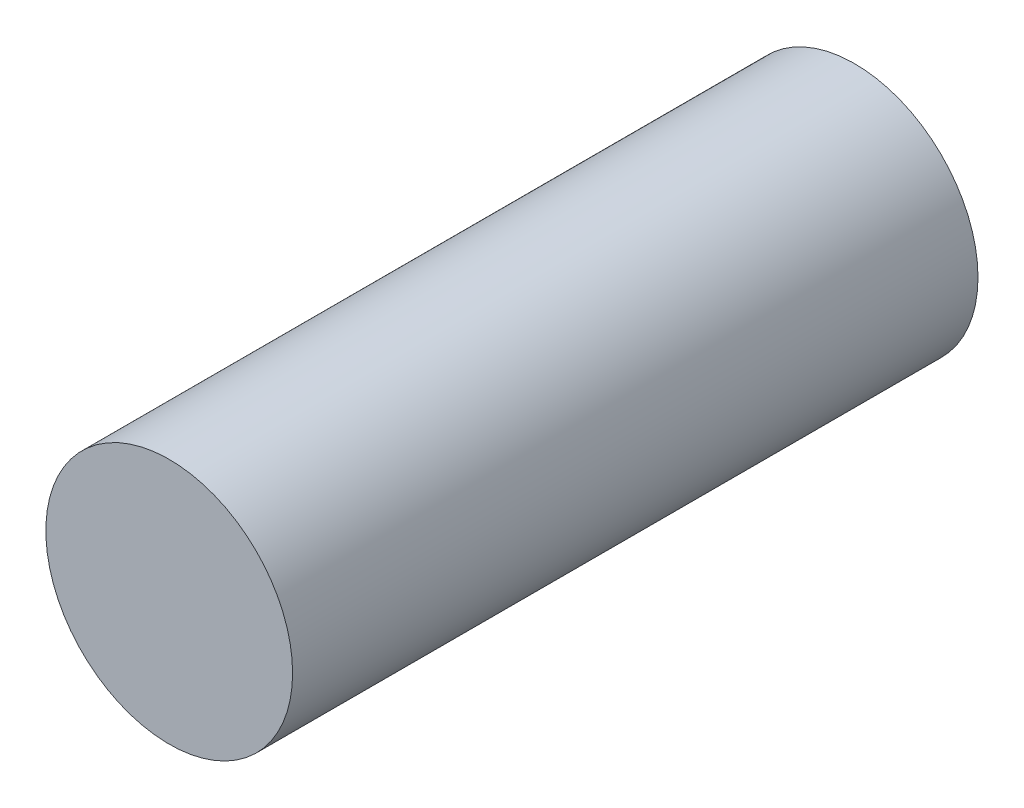
ISO-10303-21;
HEADER;
FILE_DESCRIPTION(('STEP AP214'),'2;1');
FILE_NAME('part.step','',(''),(''),'','','');
FILE_SCHEMA(('AUTOMOTIVE_DESIGN { 1 0 10303 214 1 1 1 1 }'));
ENDSEC;
DATA;
#1=APPLICATION_CONTEXT('core data for automotive mechanical design processes');
#2=APPLICATION_PROTOCOL_DEFINITION('international standard','automotive_design',2000,#1);
#3=PRODUCT_CONTEXT('',#1,'mechanical');
#4=PRODUCT('Part','Part','',(#3));
#5=PRODUCT_RELATED_PRODUCT_CATEGORY('part','',(#4));
#6=PRODUCT_DEFINITION_FORMATION('','',#4);
#7=PRODUCT_DEFINITION_CONTEXT('part definition',#1,'design');
#8=PRODUCT_DEFINITION('design','',#6,#7);
#9=PRODUCT_DEFINITION_SHAPE('','',#8);
#10=(LENGTH_UNIT() NAMED_UNIT(*) SI_UNIT(.MILLI.,.METRE.));
#11=(NAMED_UNIT(*) PLANE_ANGLE_UNIT() SI_UNIT($,.RADIAN.));
#12=(NAMED_UNIT(*) SI_UNIT($,.STERADIAN.) SOLID_ANGLE_UNIT());
#13=UNCERTAINTY_MEASURE_WITH_UNIT(LENGTH_MEASURE(1.E-05),#10,'distance_accuracy_value','');
#14=(GEOMETRIC_REPRESENTATION_CONTEXT(3) GLOBAL_UNCERTAINTY_ASSIGNED_CONTEXT((#13)) GLOBAL_UNIT_ASSIGNED_CONTEXT((#10,
#11,#12)) REPRESENTATION_CONTEXT('',''));
#15=CARTESIAN_POINT('',(0.,0.,0.));
#16=DIRECTION('',(0.,0.,1.));
#17=DIRECTION('',(1.,0.,0.));
#18=AXIS2_PLACEMENT_3D('',#15,#16,#17);
#19=CARTESIAN_POINT('',(0.,0.,12.7));
#20=DIRECTION('',(0.,0.,-1.));
#21=DIRECTION('',(-1.,0.,0.));
#22=AXIS2_PLACEMENT_3D('',#19,#20,#21);
#23=CYLINDRICAL_SURFACE('',#22,2.286);
#24=CARTESIAN_POINT('',(0.,0.,12.7));
#25=DIRECTION('',(0.,0.,1.));
#26=DIRECTION('',(1.,0.,0.));
#27=AXIS2_PLACEMENT_3D('',#24,#25,#26);
#28=CIRCLE('',#27,2.286);
#29=CARTESIAN_POINT('',(2.286,0.,12.7));
#30=VERTEX_POINT('',#29);
#31=EDGE_CURVE('E10',#30,#30,#28,.T.);
#32=ORIENTED_EDGE('',*,*,#31,.F.);
#33=EDGE_LOOP('',(#32));
#34=FACE_BOUND('',#33,.T.);
#35=CARTESIAN_POINT('',(0.,0.,0.));
#36=DIRECTION('',(0.,0.,1.));
#37=DIRECTION('',(1.,0.,0.));
#38=AXIS2_PLACEMENT_3D('',#35,#36,#37);
#39=CIRCLE('',#38,2.286);
#40=CARTESIAN_POINT('',(2.286,0.,0.));
#41=VERTEX_POINT('',#40);
#42=EDGE_CURVE('E46',#41,#41,#39,.T.);
#43=ORIENTED_EDGE('',*,*,#42,.T.);
#44=EDGE_LOOP('',(#43));
#45=FACE_BOUND('',#44,.T.);
#46=ADVANCED_FACE('F43',(#34,#45),#23,.T.);
#47=CARTESIAN_POINT('',(0.,0.,12.7));
#48=DIRECTION('',(0.,0.,1.));
#49=DIRECTION('',(1.,0.,0.));
#50=AXIS2_PLACEMENT_3D('',#47,#48,#49);
#51=PLANE('',#50);
#52=ORIENTED_EDGE('',*,*,#31,.T.);
#53=EDGE_LOOP('',(#52));
#54=FACE_BOUND('',#53,.T.);
#55=ADVANCED_FACE('F60',(#54),#51,.T.);
#56=CARTESIAN_POINT('',(0.,0.,0.));
#57=DIRECTION('',(0.,0.,1.));
#58=DIRECTION('',(1.,0.,0.));
#59=AXIS2_PLACEMENT_3D('',#56,#57,#58);
#60=PLANE('',#59);
#61=ORIENTED_EDGE('',*,*,#42,.F.);
#62=EDGE_LOOP('',(#61));
#63=FACE_BOUND('',#62,.T.);
#64=ADVANCED_FACE('F58',(#63),#60,.F.);
#65=CLOSED_SHELL('',(#46,#55,#64));
#66=MANIFOLD_SOLID_BREP('B2',#65);
#67=ADVANCED_BREP_SHAPE_REPRESENTATION('',(#18,#66),#14);
#68=SHAPE_DEFINITION_REPRESENTATION(#9,#67);
ENDSEC;
END-ISO-10303-21;
